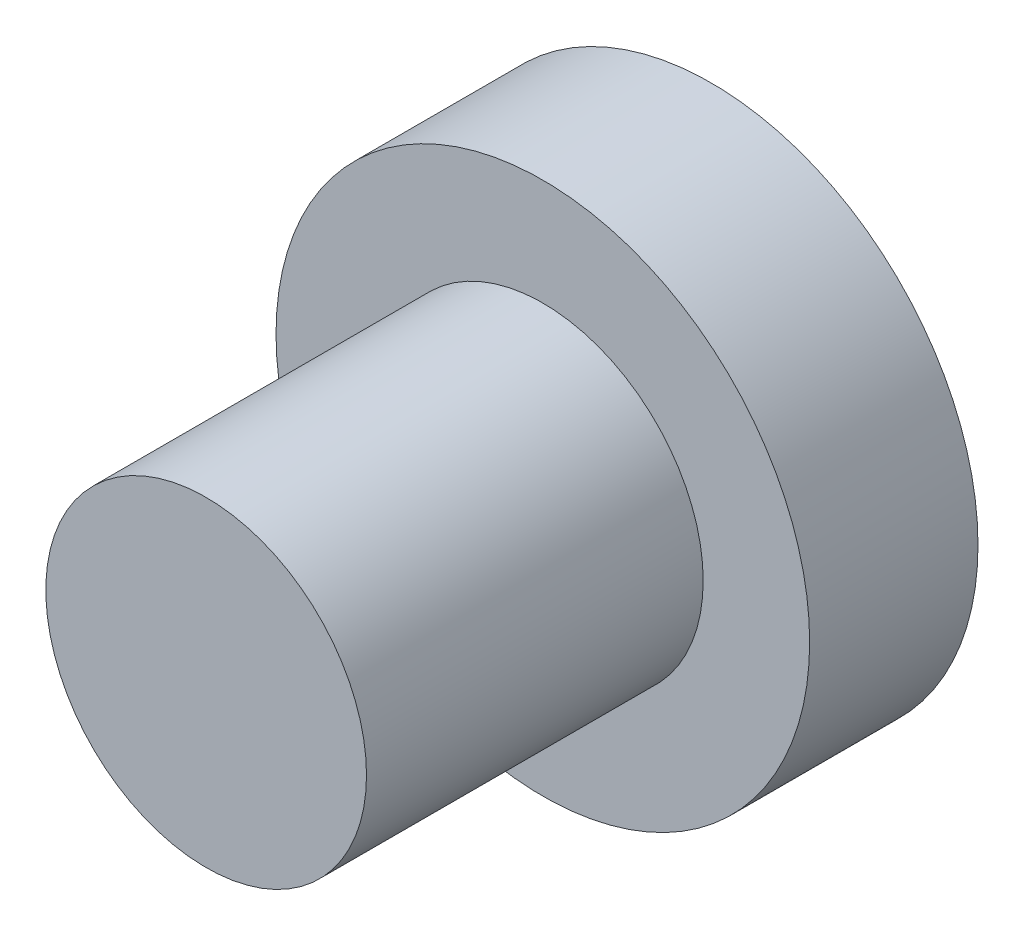
ISO-10303-21;
HEADER;
FILE_DESCRIPTION(('STEP AP214'),'2;1');
FILE_NAME('part.step','',(''),(''),'','','');
FILE_SCHEMA(('AUTOMOTIVE_DESIGN { 1 0 10303 214 1 1 1 1 }'));
ENDSEC;
DATA;
#1=APPLICATION_CONTEXT('core data for automotive mechanical design processes');
#2=APPLICATION_PROTOCOL_DEFINITION('international standard','automotive_design',2000,#1);
#3=PRODUCT_CONTEXT('',#1,'mechanical');
#4=PRODUCT('Part','Part','',(#3));
#5=PRODUCT_RELATED_PRODUCT_CATEGORY('part','',(#4));
#6=PRODUCT_DEFINITION_FORMATION('','',#4);
#7=PRODUCT_DEFINITION_CONTEXT('part definition',#1,'design');
#8=PRODUCT_DEFINITION('design','',#6,#7);
#9=PRODUCT_DEFINITION_SHAPE('','',#8);
#10=(LENGTH_UNIT() NAMED_UNIT(*) SI_UNIT(.MILLI.,.METRE.));
#11=(NAMED_UNIT(*) PLANE_ANGLE_UNIT() SI_UNIT($,.RADIAN.));
#12=(NAMED_UNIT(*) SI_UNIT($,.STERADIAN.) SOLID_ANGLE_UNIT());
#13=UNCERTAINTY_MEASURE_WITH_UNIT(LENGTH_MEASURE(1.E-05),#10,'distance_accuracy_value','');
#14=(GEOMETRIC_REPRESENTATION_CONTEXT(3) GLOBAL_UNCERTAINTY_ASSIGNED_CONTEXT((#13)) GLOBAL_UNIT_ASSIGNED_CONTEXT((#10,
#11,#12)) REPRESENTATION_CONTEXT('',''));
#15=CARTESIAN_POINT('',(0.,0.,0.));
#16=DIRECTION('',(0.,0.,1.));
#17=DIRECTION('',(1.,0.,0.));
#18=AXIS2_PLACEMENT_3D('',#15,#16,#17);
#19=CARTESIAN_POINT('',(0.,0.,5.));
#20=DIRECTION('',(0.,0.,1.));
#21=DIRECTION('',(1.,0.,0.));
#22=AXIS2_PLACEMENT_3D('',#19,#20,#21);
#23=PLANE('',#22);
#24=CARTESIAN_POINT('',(0.,0.,5.));
#25=DIRECTION('',(0.,0.,1.));
#26=DIRECTION('',(1.,0.,0.));
#27=AXIS2_PLACEMENT_3D('',#24,#25,#26);
#28=CIRCLE('',#27,7.925);
#29=CARTESIAN_POINT('',(7.925,0.,5.));
#30=VERTEX_POINT('',#29);
#31=EDGE_CURVE('E10',#30,#30,#28,.T.);
#32=ORIENTED_EDGE('',*,*,#31,.T.);
#33=EDGE_LOOP('',(#32));
#34=FACE_BOUND('',#33,.T.);
#35=CARTESIAN_POINT('',(0.,0.,5.));
#36=DIRECTION('',(0.,0.,1.));
#37=DIRECTION('',(1.,0.,0.));
#38=AXIS2_PLACEMENT_3D('',#35,#36,#37);
#39=CIRCLE('',#38,4.7625);
#40=CARTESIAN_POINT('',(4.7625,0.,5.));
#41=VERTEX_POINT('',#40);
#42=EDGE_CURVE('E42',#41,#41,#39,.T.);
#43=ORIENTED_EDGE('',*,*,#42,.F.);
#44=EDGE_LOOP('',(#43));
#45=FACE_BOUND('',#44,.T.);
#46=ADVANCED_FACE('F27',(#34,#45),#23,.T.);
#47=CARTESIAN_POINT('',(0.,0.,5.));
#48=DIRECTION('',(0.,0.,-1.));
#49=DIRECTION('',(-1.,0.,0.));
#50=AXIS2_PLACEMENT_3D('',#47,#48,#49);
#51=CYLINDRICAL_SURFACE('',#50,7.925);
#52=ORIENTED_EDGE('',*,*,#31,.F.);
#53=EDGE_LOOP('',(#52));
#54=FACE_BOUND('',#53,.T.);
#55=CARTESIAN_POINT('',(0.,0.,0.));
#56=DIRECTION('',(0.,0.,1.));
#57=DIRECTION('',(1.,0.,0.));
#58=AXIS2_PLACEMENT_3D('',#55,#56,#57);
#59=CIRCLE('',#58,7.925);
#60=CARTESIAN_POINT('',(7.925,0.,0.));
#61=VERTEX_POINT('',#60);
#62=EDGE_CURVE('E34',#61,#61,#59,.T.);
#63=ORIENTED_EDGE('',*,*,#62,.T.);
#64=EDGE_LOOP('',(#63));
#65=FACE_BOUND('',#64,.T.);
#66=ADVANCED_FACE('F29',(#54,#65),#51,.T.);
#67=CARTESIAN_POINT('',(0.,0.,0.));
#68=DIRECTION('',(0.,0.,1.));
#69=DIRECTION('',(1.,0.,0.));
#70=AXIS2_PLACEMENT_3D('',#67,#68,#69);
#71=PLANE('',#70);
#72=ORIENTED_EDGE('',*,*,#62,.F.);
#73=EDGE_LOOP('',(#72));
#74=FACE_BOUND('',#73,.T.);
#75=ADVANCED_FACE('F54',(#74),#71,.F.);
#76=CARTESIAN_POINT('',(0.,0.,15.));
#77=DIRECTION('',(0.,0.,-1.));
#78=DIRECTION('',(-1.,0.,0.));
#79=AXIS2_PLACEMENT_3D('',#76,#77,#78);
#80=CYLINDRICAL_SURFACE('',#79,4.7625);
#81=CARTESIAN_POINT('',(0.,0.,15.));
#82=DIRECTION('',(0.,0.,1.));
#83=DIRECTION('',(1.,0.,0.));
#84=AXIS2_PLACEMENT_3D('',#81,#82,#83);
#85=CIRCLE('',#84,4.7625);
#86=CARTESIAN_POINT('',(4.7625,0.,15.));
#87=VERTEX_POINT('',#86);
#88=EDGE_CURVE('E38',#87,#87,#85,.T.);
#89=ORIENTED_EDGE('',*,*,#88,.F.);
#90=EDGE_LOOP('',(#89));
#91=FACE_BOUND('',#90,.T.);
#92=ORIENTED_EDGE('',*,*,#42,.T.);
#93=EDGE_LOOP('',(#92));
#94=FACE_BOUND('',#93,.T.);
#95=ADVANCED_FACE('F48',(#91,#94),#80,.T.);
#96=CARTESIAN_POINT('',(0.,0.,15.));
#97=DIRECTION('',(0.,0.,1.));
#98=DIRECTION('',(1.,0.,0.));
#99=AXIS2_PLACEMENT_3D('',#96,#97,#98);
#100=PLANE('',#99);
#101=ORIENTED_EDGE('',*,*,#88,.T.);
#102=EDGE_LOOP('',(#101));
#103=FACE_BOUND('',#102,.T.);
#104=ADVANCED_FACE('F62',(#103),#100,.T.);
#105=CLOSED_SHELL('',(#46,#66,#75,#95,#104));
#106=MANIFOLD_SOLID_BREP('B2',#105);
#107=ADVANCED_BREP_SHAPE_REPRESENTATION('',(#18,#106),#14);
#108=SHAPE_DEFINITION_REPRESENTATION(#9,#107);
ENDSEC;
END-ISO-10303-21;
